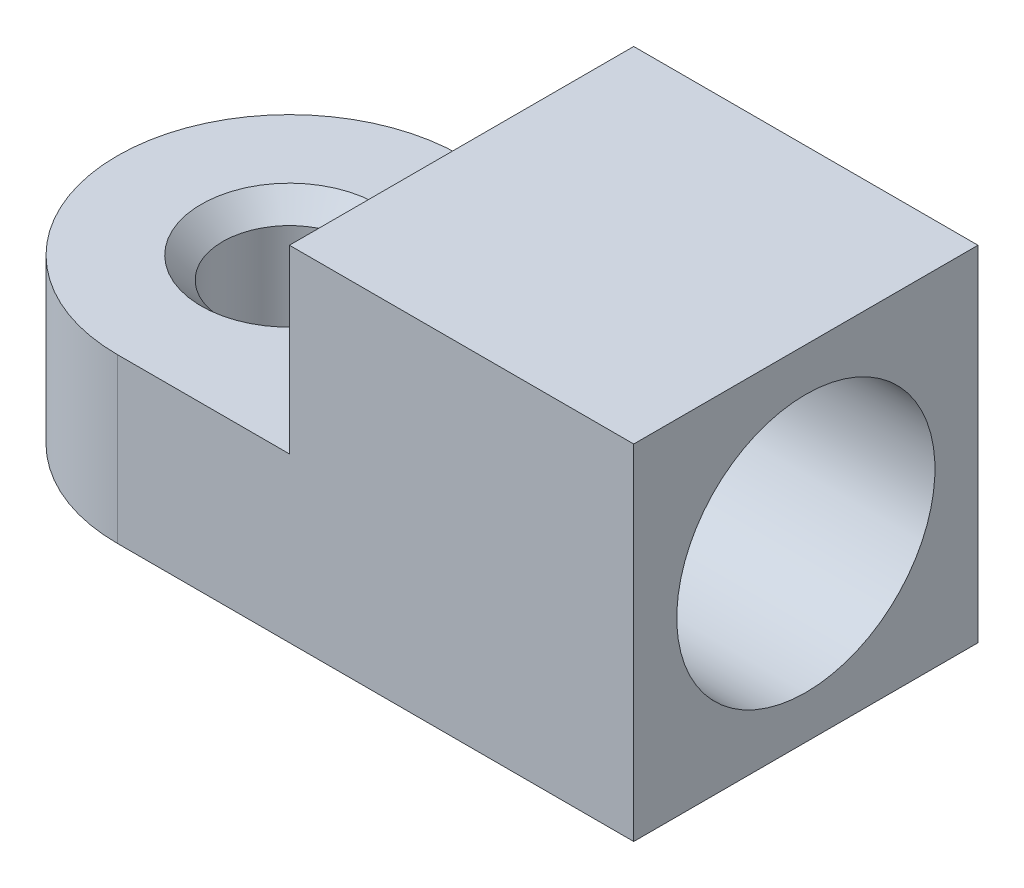
ISO-10303-21;
HEADER;
FILE_DESCRIPTION(('STEP AP214'),'2;1');
FILE_NAME('part.step','',(''),(''),'','','');
FILE_SCHEMA(('AUTOMOTIVE_DESIGN { 1 0 10303 214 1 1 1 1 }'));
ENDSEC;
DATA;
#1=APPLICATION_CONTEXT('core data for automotive mechanical design processes');
#2=APPLICATION_PROTOCOL_DEFINITION('international standard','automotive_design',2000,#1);
#3=PRODUCT_CONTEXT('',#1,'mechanical');
#4=PRODUCT('Part','Part','',(#3));
#5=PRODUCT_RELATED_PRODUCT_CATEGORY('part','',(#4));
#6=PRODUCT_DEFINITION_FORMATION('','',#4);
#7=PRODUCT_DEFINITION_CONTEXT('part definition',#1,'design');
#8=PRODUCT_DEFINITION('design','',#6,#7);
#9=PRODUCT_DEFINITION_SHAPE('','',#8);
#10=(LENGTH_UNIT() NAMED_UNIT(*) SI_UNIT(.MILLI.,.METRE.));
#11=(NAMED_UNIT(*) PLANE_ANGLE_UNIT() SI_UNIT($,.RADIAN.));
#12=(NAMED_UNIT(*) SI_UNIT($,.STERADIAN.) SOLID_ANGLE_UNIT());
#13=UNCERTAINTY_MEASURE_WITH_UNIT(LENGTH_MEASURE(1.E-05),#10,'distance_accuracy_value','');
#14=(GEOMETRIC_REPRESENTATION_CONTEXT(3) GLOBAL_UNCERTAINTY_ASSIGNED_CONTEXT((#13)) GLOBAL_UNIT_ASSIGNED_CONTEXT((#10,
#11,#12)) REPRESENTATION_CONTEXT('',''));
#15=CARTESIAN_POINT('',(0.,0.,0.));
#16=DIRECTION('',(0.,0.,1.));
#17=DIRECTION('',(1.,0.,0.));
#18=AXIS2_PLACEMENT_3D('',#15,#16,#17);
#19=CARTESIAN_POINT('',(-8.,0.,4.));
#20=DIRECTION('',(0.,1.,0.));
#21=DIRECTION('',(0.,0.,1.));
#22=AXIS2_PLACEMENT_3D('',#19,#20,#21);
#23=PLANE('',#22);
#24=CARTESIAN_POINT('',(-4.,0.,0.));
#25=DIRECTION('',(0.,1.,0.));
#26=DIRECTION('',(-1.,0.,0.));
#27=AXIS2_PLACEMENT_3D('',#24,#25,#26);
#28=CIRCLE('',#27,1.55);
#29=CARTESIAN_POINT('',(-5.55,0.,0.));
#30=VERTEX_POINT('',#29);
#31=EDGE_CURVE('E151',#30,#30,#28,.T.);
#32=ORIENTED_EDGE('',*,*,#31,.T.);
#33=EDGE_LOOP('',(#32));
#34=FACE_BOUND('',#33,.T.);
#35=CARTESIAN_POINT('',(-4.,0.,0.));
#36=DIRECTION('',(0.,1.,0.));
#37=DIRECTION('',(0.,0.,1.));
#38=AXIS2_PLACEMENT_3D('',#35,#36,#37);
#39=CIRCLE('',#38,4.);
#40=CARTESIAN_POINT('',(-4.,0.,4.));
#41=VERTEX_POINT('',#40);
#42=CARTESIAN_POINT('',(-8.,0.,0.));
#43=VERTEX_POINT('',#42);
#44=EDGE_CURVE('E108',#41,#43,#39,.F.);
#45=ORIENTED_EDGE('',*,*,#44,.T.);
#46=CARTESIAN_POINT('',(-4.,0.,0.));
#47=DIRECTION('',(0.,1.,0.));
#48=DIRECTION('',(0.,0.,1.));
#49=AXIS2_PLACEMENT_3D('',#46,#47,#48);
#50=CIRCLE('',#49,4.);
#51=CARTESIAN_POINT('',(-4.,0.,-4.));
#52=VERTEX_POINT('',#51);
#53=EDGE_CURVE('E140',#43,#52,#50,.F.);
#54=ORIENTED_EDGE('',*,*,#53,.T.);
#55=DIRECTION('',(1.,0.,0.));
#56=VECTOR('',#55,1.);
#57=CARTESIAN_POINT('',(-8.,0.,-4.));
#58=LINE('',#57,#56);
#59=CARTESIAN_POINT('',(8.,0.,-4.));
#60=VERTEX_POINT('',#59);
#61=EDGE_CURVE('E105',#52,#60,#58,.T.);
#62=ORIENTED_EDGE('',*,*,#61,.T.);
#63=DIRECTION('',(0.,0.,-1.));
#64=VECTOR('',#63,1.);
#65=CARTESIAN_POINT('',(8.,0.,4.));
#66=LINE('',#65,#64);
#67=CARTESIAN_POINT('',(8.,0.,4.));
#68=VERTEX_POINT('',#67);
#69=EDGE_CURVE('E103',#68,#60,#66,.T.);
#70=ORIENTED_EDGE('',*,*,#69,.F.);
#71=DIRECTION('',(1.,0.,0.));
#72=VECTOR('',#71,1.);
#73=CARTESIAN_POINT('',(-8.,0.,4.));
#74=LINE('',#73,#72);
#75=EDGE_CURVE('E90',#41,#68,#74,.T.);
#76=ORIENTED_EDGE('',*,*,#75,.F.);
#77=EDGE_LOOP('',(#45,#54,#62,#70,#76));
#78=FACE_BOUND('',#77,.T.);
#79=ADVANCED_FACE('F33',(#34,#78),#23,.F.);
#80=CARTESIAN_POINT('',(8.,0.,4.));
#81=DIRECTION('',(-1.,0.,0.));
#82=DIRECTION('',(0.,-1.,0.));
#83=AXIS2_PLACEMENT_3D('',#80,#81,#82);
#84=PLANE('',#83);
#85=CARTESIAN_POINT('',(8.,4.,0.));
#86=DIRECTION('',(1.,0.,0.));
#87=DIRECTION('',(0.,1.,0.));
#88=AXIS2_PLACEMENT_3D('',#85,#86,#87);
#89=CIRCLE('',#88,3.);
#90=CARTESIAN_POINT('',(8.,7.,0.));
#91=VERTEX_POINT('',#90);
#92=EDGE_CURVE('E150',#91,#91,#89,.T.);
#93=ORIENTED_EDGE('',*,*,#92,.F.);
#94=EDGE_LOOP('',(#93));
#95=FACE_BOUND('',#94,.T.);
#96=DIRECTION('',(0.,1.,0.));
#97=VECTOR('',#96,1.);
#98=CARTESIAN_POINT('',(8.,0.,-4.));
#99=LINE('',#98,#97);
#100=CARTESIAN_POINT('',(8.,8.,-4.));
#101=VERTEX_POINT('',#100);
#102=EDGE_CURVE('E125',#60,#101,#99,.T.);
#103=ORIENTED_EDGE('',*,*,#102,.T.);
#104=DIRECTION('',(0.,0.,-1.));
#105=VECTOR('',#104,1.);
#106=CARTESIAN_POINT('',(8.,8.,4.));
#107=LINE('',#106,#105);
#108=CARTESIAN_POINT('',(8.,8.,4.));
#109=VERTEX_POINT('',#108);
#110=EDGE_CURVE('E109',#109,#101,#107,.T.);
#111=ORIENTED_EDGE('',*,*,#110,.F.);
#112=DIRECTION('',(0.,1.,0.));
#113=VECTOR('',#112,1.);
#114=CARTESIAN_POINT('',(8.,0.,4.));
#115=LINE('',#114,#113);
#116=EDGE_CURVE('E94',#68,#109,#115,.T.);
#117=ORIENTED_EDGE('',*,*,#116,.F.);
#118=ORIENTED_EDGE('',*,*,#69,.T.);
#119=EDGE_LOOP('',(#103,#111,#117,#118));
#120=FACE_BOUND('',#119,.T.);
#121=ADVANCED_FACE('F111',(#95,#120),#84,.F.);
#122=CARTESIAN_POINT('',(8.,8.,4.));
#123=DIRECTION('',(0.,-1.,0.));
#124=DIRECTION('',(0.,0.,-1.));
#125=AXIS2_PLACEMENT_3D('',#122,#123,#124);
#126=PLANE('',#125);
#127=DIRECTION('',(-1.,0.,0.));
#128=VECTOR('',#127,1.);
#129=CARTESIAN_POINT('',(8.,8.,-4.));
#130=LINE('',#129,#128);
#131=CARTESIAN_POINT('',(0.,8.,-4.));
#132=VERTEX_POINT('',#131);
#133=EDGE_CURVE('E128',#101,#132,#130,.T.);
#134=ORIENTED_EDGE('',*,*,#133,.T.);
#135=DIRECTION('',(0.,0.,-1.));
#136=VECTOR('',#135,1.);
#137=CARTESIAN_POINT('',(0.,8.,4.));
#138=LINE('',#137,#136);
#139=CARTESIAN_POINT('',(0.,8.,4.));
#140=VERTEX_POINT('',#139);
#141=EDGE_CURVE('E135',#140,#132,#138,.T.);
#142=ORIENTED_EDGE('',*,*,#141,.F.);
#143=DIRECTION('',(-1.,0.,0.));
#144=VECTOR('',#143,1.);
#145=CARTESIAN_POINT('',(8.,8.,4.));
#146=LINE('',#145,#144);
#147=EDGE_CURVE('E114',#109,#140,#146,.T.);
#148=ORIENTED_EDGE('',*,*,#147,.F.);
#149=ORIENTED_EDGE('',*,*,#110,.T.);
#150=EDGE_LOOP('',(#134,#142,#148,#149));
#151=FACE_BOUND('',#150,.T.);
#152=ADVANCED_FACE('F173',(#151),#126,.F.);
#153=CARTESIAN_POINT('',(0.,8.,4.));
#154=DIRECTION('',(1.,0.,0.));
#155=DIRECTION('',(0.,1.,0.));
#156=AXIS2_PLACEMENT_3D('',#153,#154,#155);
#157=PLANE('',#156);
#158=DIRECTION('',(0.,-1.,0.));
#159=VECTOR('',#158,1.);
#160=CARTESIAN_POINT('',(0.,8.,-4.));
#161=LINE('',#160,#159);
#162=CARTESIAN_POINT('',(0.,3.8,-4.));
#163=VERTEX_POINT('',#162);
#164=EDGE_CURVE('E130',#132,#163,#161,.T.);
#165=ORIENTED_EDGE('',*,*,#164,.T.);
#166=DIRECTION('',(0.,0.,-1.));
#167=VECTOR('',#166,1.);
#168=CARTESIAN_POINT('',(0.,3.8,4.));
#169=LINE('',#168,#167);
#170=CARTESIAN_POINT('',(0.,3.8,4.));
#171=VERTEX_POINT('',#170);
#172=EDGE_CURVE('E123',#171,#163,#169,.T.);
#173=ORIENTED_EDGE('',*,*,#172,.F.);
#174=DIRECTION('',(0.,-1.,0.));
#175=VECTOR('',#174,1.);
#176=CARTESIAN_POINT('',(0.,8.,4.));
#177=LINE('',#176,#175);
#178=EDGE_CURVE('E116',#140,#171,#177,.T.);
#179=ORIENTED_EDGE('',*,*,#178,.F.);
#180=ORIENTED_EDGE('',*,*,#141,.T.);
#181=EDGE_LOOP('',(#165,#173,#179,#180));
#182=FACE_BOUND('',#181,.T.);
#183=ADVANCED_FACE('F204',(#182),#157,.F.);
#184=CARTESIAN_POINT('',(0.,3.8,4.));
#185=DIRECTION('',(0.,-1.,0.));
#186=DIRECTION('',(1.,0.,0.));
#187=AXIS2_PLACEMENT_3D('',#184,#185,#186);
#188=PLANE('',#187);
#189=CARTESIAN_POINT('',(-4.,3.8,0.));
#190=DIRECTION('',(0.,-1.,0.));
#191=DIRECTION('',(1.,0.,0.));
#192=AXIS2_PLACEMENT_3D('',#189,#190,#191);
#193=CIRCLE('',#192,2.05000000000002);
#194=CARTESIAN_POINT('',(-1.94999999999998,3.8,0.));
#195=VERTEX_POINT('',#194);
#196=EDGE_CURVE('E11',#195,#195,#193,.T.);
#197=ORIENTED_EDGE('',*,*,#196,.T.);
#198=EDGE_LOOP('',(#197));
#199=FACE_BOUND('',#198,.T.);
#200=DIRECTION('',(-1.,0.,0.));
#201=VECTOR('',#200,1.);
#202=CARTESIAN_POINT('',(0.,3.8,-4.));
#203=LINE('',#202,#201);
#204=CARTESIAN_POINT('',(-4.,3.8,-4.));
#205=VERTEX_POINT('',#204);
#206=EDGE_CURVE('E100',#163,#205,#203,.T.);
#207=ORIENTED_EDGE('',*,*,#206,.T.);
#208=CARTESIAN_POINT('',(-4.,3.8,0.));
#209=DIRECTION('',(0.,-1.,0.));
#210=DIRECTION('',(1.,0.,0.));
#211=AXIS2_PLACEMENT_3D('',#208,#209,#210);
#212=CIRCLE('',#211,4.);
#213=CARTESIAN_POINT('',(-8.,3.8,0.));
#214=VERTEX_POINT('',#213);
#215=EDGE_CURVE('E53',#205,#214,#212,.F.);
#216=ORIENTED_EDGE('',*,*,#215,.T.);
#217=CARTESIAN_POINT('',(-4.,3.8,0.));
#218=DIRECTION('',(0.,-1.,0.));
#219=DIRECTION('',(1.,0.,0.));
#220=AXIS2_PLACEMENT_3D('',#217,#218,#219);
#221=CIRCLE('',#220,4.);
#222=CARTESIAN_POINT('',(-4.,3.8,4.));
#223=VERTEX_POINT('',#222);
#224=EDGE_CURVE('E48',#214,#223,#221,.F.);
#225=ORIENTED_EDGE('',*,*,#224,.T.);
#226=DIRECTION('',(-1.,0.,0.));
#227=VECTOR('',#226,1.);
#228=CARTESIAN_POINT('',(0.,3.8,4.));
#229=LINE('',#228,#227);
#230=EDGE_CURVE('E121',#171,#223,#229,.T.);
#231=ORIENTED_EDGE('',*,*,#230,.F.);
#232=ORIENTED_EDGE('',*,*,#172,.T.);
#233=EDGE_LOOP('',(#207,#216,#225,#231,#232));
#234=FACE_BOUND('',#233,.T.);
#235=ADVANCED_FACE('F205',(#199,#234),#188,.F.);
#236=CARTESIAN_POINT('',(0.,0.,4.));
#237=DIRECTION('',(0.,0.,1.));
#238=DIRECTION('',(1.,0.,0.));
#239=AXIS2_PLACEMENT_3D('',#236,#237,#238);
#240=PLANE('',#239);
#241=ORIENTED_EDGE('',*,*,#230,.T.);
#242=DIRECTION('',(0.,-1.,0.));
#243=VECTOR('',#242,1.);
#244=CARTESIAN_POINT('',(-4.,0.,4.));
#245=LINE('',#244,#243);
#246=EDGE_CURVE('E97',#223,#41,#245,.T.);
#247=ORIENTED_EDGE('',*,*,#246,.T.);
#248=ORIENTED_EDGE('',*,*,#75,.T.);
#249=ORIENTED_EDGE('',*,*,#116,.T.);
#250=ORIENTED_EDGE('',*,*,#147,.T.);
#251=ORIENTED_EDGE('',*,*,#178,.T.);
#252=EDGE_LOOP('',(#241,#247,#248,#249,#250,#251));
#253=FACE_BOUND('',#252,.T.);
#254=ADVANCED_FACE('F92',(#253),#240,.T.);
#255=CARTESIAN_POINT('',(0.,0.,-4.));
#256=DIRECTION('',(0.,0.,1.));
#257=DIRECTION('',(1.,0.,0.));
#258=AXIS2_PLACEMENT_3D('',#255,#256,#257);
#259=PLANE('',#258);
#260=ORIENTED_EDGE('',*,*,#61,.F.);
#261=DIRECTION('',(0.,-1.,0.));
#262=VECTOR('',#261,1.);
#263=CARTESIAN_POINT('',(-4.,0.,-4.));
#264=LINE('',#263,#262);
#265=EDGE_CURVE('E142',#52,#205,#264,.F.);
#266=ORIENTED_EDGE('',*,*,#265,.T.);
#267=ORIENTED_EDGE('',*,*,#206,.F.);
#268=ORIENTED_EDGE('',*,*,#164,.F.);
#269=ORIENTED_EDGE('',*,*,#133,.F.);
#270=ORIENTED_EDGE('',*,*,#102,.F.);
#271=EDGE_LOOP('',(#260,#266,#267,#268,#269,#270));
#272=FACE_BOUND('',#271,.T.);
#273=ADVANCED_FACE('F195',(#272),#259,.F.);
#274=CARTESIAN_POINT('',(1.,4.,0.));
#275=DIRECTION('',(1.,0.,0.));
#276=DIRECTION('',(0.,1.,0.));
#277=AXIS2_PLACEMENT_3D('',#274,#275,#276);
#278=CYLINDRICAL_SURFACE('',#277,3.);
#279=CARTESIAN_POINT('',(1.,4.,0.));
#280=DIRECTION('',(1.,0.,0.));
#281=DIRECTION('',(0.,1.,0.));
#282=AXIS2_PLACEMENT_3D('',#279,#280,#281);
#283=CIRCLE('',#282,3.);
#284=CARTESIAN_POINT('',(0.999999999999999,7.,0.));
#285=VERTEX_POINT('',#284);
#286=EDGE_CURVE('E126',#285,#285,#283,.T.);
#287=ORIENTED_EDGE('',*,*,#286,.F.);
#288=EDGE_LOOP('',(#287));
#289=FACE_BOUND('',#288,.T.);
#290=ORIENTED_EDGE('',*,*,#92,.T.);
#291=EDGE_LOOP('',(#290));
#292=FACE_BOUND('',#291,.T.);
#293=ADVANCED_FACE('F188',(#289,#292),#278,.F.);
#294=CARTESIAN_POINT('',(1.,4.,0.));
#295=DIRECTION('',(1.,0.,0.));
#296=DIRECTION('',(0.,1.,0.));
#297=AXIS2_PLACEMENT_3D('',#294,#295,#296);
#298=PLANE('',#297);
#299=ORIENTED_EDGE('',*,*,#286,.T.);
#300=EDGE_LOOP('',(#299));
#301=FACE_BOUND('',#300,.T.);
#302=ADVANCED_FACE('F183',(#301),#298,.T.);
#303=CARTESIAN_POINT('',(-4.,0.,0.));
#304=DIRECTION('',(0.,1.,0.));
#305=DIRECTION('',(-1.,0.,0.));
#306=AXIS2_PLACEMENT_3D('',#303,#304,#305);
#307=CYLINDRICAL_SURFACE('',#306,4.);
#308=ORIENTED_EDGE('',*,*,#246,.F.);
#309=ORIENTED_EDGE('',*,*,#224,.F.);
#310=DIRECTION('',(0.,-1.,0.));
#311=VECTOR('',#310,1.);
#312=CARTESIAN_POINT('',(-8.,3.8,0.));
#313=LINE('',#312,#311);
#314=EDGE_CURVE('E148',#43,#214,#313,.F.);
#315=ORIENTED_EDGE('',*,*,#314,.F.);
#316=ORIENTED_EDGE('',*,*,#44,.F.);
#317=EDGE_LOOP('',(#308,#309,#315,#316));
#318=FACE_BOUND('',#317,.T.);
#319=ADVANCED_FACE('F180',(#318),#307,.T.);
#320=CARTESIAN_POINT('',(-4.,3.8,0.));
#321=DIRECTION('',(0.,-1.,0.));
#322=DIRECTION('',(1.,0.,0.));
#323=AXIS2_PLACEMENT_3D('',#320,#321,#322);
#324=CYLINDRICAL_SURFACE('',#323,4.);
#325=ORIENTED_EDGE('',*,*,#215,.F.);
#326=ORIENTED_EDGE('',*,*,#265,.F.);
#327=ORIENTED_EDGE('',*,*,#53,.F.);
#328=ORIENTED_EDGE('',*,*,#314,.T.);
#329=EDGE_LOOP('',(#325,#326,#327,#328));
#330=FACE_BOUND('',#329,.T.);
#331=ADVANCED_FACE('F164',(#330),#324,.T.);
#332=CARTESIAN_POINT('',(-4.,0.,0.));
#333=DIRECTION('',(0.,1.,0.));
#334=DIRECTION('',(-1.,0.,0.));
#335=AXIS2_PLACEMENT_3D('',#332,#333,#334);
#336=CYLINDRICAL_SURFACE('',#335,1.55);
#337=CARTESIAN_POINT('',(-4.,3.29999999999999,0.));
#338=DIRECTION('',(0.,-1.,0.));
#339=DIRECTION('',(0.,0.,-1.));
#340=AXIS2_PLACEMENT_3D('',#337,#338,#339);
#341=CIRCLE('',#340,1.55);
#342=CARTESIAN_POINT('',(-5.55,3.29999999999999,0.));
#343=VERTEX_POINT('',#342);
#344=EDGE_CURVE('E41',#343,#343,#341,.F.);
#345=CARTESIAN_POINT('',(-5.55,3.29999999999999,0.));
#346=CARTESIAN_POINT('',(-5.55,3.26562499999999,0.));
#347=CARTESIAN_POINT('',(-5.55,3.23124999999999,0.));
#348=CARTESIAN_POINT('',(-5.55,3.16249999999999,0.));
#349=CARTESIAN_POINT('',(-5.55,3.12812499999999,0.));
#350=CARTESIAN_POINT('',(-5.55,3.05937499999999,0.));
#351=CARTESIAN_POINT('',(-5.55,3.02499999999999,0.));
#352=CARTESIAN_POINT('',(-5.55,2.95624999999999,0.));
#353=CARTESIAN_POINT('',(-5.55,2.92187499999999,0.));
#354=CARTESIAN_POINT('',(-5.55,2.85312499999999,0.));
#355=CARTESIAN_POINT('',(-5.55,2.81874999999999,0.));
#356=CARTESIAN_POINT('',(-5.55,2.74999999999999,0.));
#357=CARTESIAN_POINT('',(-5.55,2.71562499999999,0.));
#358=CARTESIAN_POINT('',(-5.55,2.64687499999999,0.));
#359=CARTESIAN_POINT('',(-5.55,2.61249999999999,0.));
#360=CARTESIAN_POINT('',(-5.55,2.54374999999999,0.));
#361=CARTESIAN_POINT('',(-5.55,2.50937499999999,0.));
#362=CARTESIAN_POINT('',(-5.55,2.44062499999999,0.));
#363=CARTESIAN_POINT('',(-5.55,2.40624999999999,0.));
#364=CARTESIAN_POINT('',(-5.55,2.33749999999999,0.));
#365=CARTESIAN_POINT('',(-5.55,2.30312499999999,0.));
#366=CARTESIAN_POINT('',(-5.55,2.23437499999999,0.));
#367=CARTESIAN_POINT('',(-5.55,2.19999999999999,0.));
#368=CARTESIAN_POINT('',(-5.55,2.13124999999999,0.));
#369=CARTESIAN_POINT('',(-5.55,2.09687499999999,0.));
#370=CARTESIAN_POINT('',(-5.55,2.02812499999999,0.));
#371=CARTESIAN_POINT('',(-5.55,1.99374999999999,0.));
#372=CARTESIAN_POINT('',(-5.55,1.92499999999999,0.));
#373=CARTESIAN_POINT('',(-5.55,1.89062499999999,0.));
#374=CARTESIAN_POINT('',(-5.55,1.82187499999999,0.));
#375=CARTESIAN_POINT('',(-5.55,1.78749999999999,0.));
#376=CARTESIAN_POINT('',(-5.55,1.71874999999999,0.));
#377=CARTESIAN_POINT('',(-5.55,1.68437499999999,0.));
#378=CARTESIAN_POINT('',(-5.55,1.61562499999999,0.));
#379=CARTESIAN_POINT('',(-5.55,1.58124999999999,0.));
#380=CARTESIAN_POINT('',(-5.55,1.51249999999999,0.));
#381=CARTESIAN_POINT('',(-5.55,1.47812499999999,0.));
#382=CARTESIAN_POINT('',(-5.55,1.40937499999999,0.));
#383=CARTESIAN_POINT('',(-5.55,1.37499999999999,0.));
#384=CARTESIAN_POINT('',(-5.55,1.30624999999999,0.));
#385=CARTESIAN_POINT('',(-5.55,1.27187499999999,0.));
#386=CARTESIAN_POINT('',(-5.55,1.20312499999999,0.));
#387=CARTESIAN_POINT('',(-5.55,1.16874999999999,0.));
#388=CARTESIAN_POINT('',(-5.55,1.09999999999999,0.));
#389=CARTESIAN_POINT('',(-5.55,1.06562499999999,0.));
#390=CARTESIAN_POINT('',(-5.55,0.996874999999994,0.));
#391=CARTESIAN_POINT('',(-5.55,0.962499999999994,0.));
#392=CARTESIAN_POINT('',(-5.55,0.893749999999995,0.));
#393=CARTESIAN_POINT('',(-5.55,0.859374999999995,0.));
#394=CARTESIAN_POINT('',(-5.55,0.790624999999995,0.));
#395=CARTESIAN_POINT('',(-5.55,0.756249999999995,0.));
#396=CARTESIAN_POINT('',(-5.55,0.687499999999996,0.));
#397=CARTESIAN_POINT('',(-5.55,0.653124999999996,0.));
#398=CARTESIAN_POINT('',(-5.55,0.584374999999996,0.));
#399=CARTESIAN_POINT('',(-5.55,0.549999999999996,0.));
#400=CARTESIAN_POINT('',(-5.55,0.481249999999996,0.));
#401=CARTESIAN_POINT('',(-5.55,0.446874999999997,0.));
#402=CARTESIAN_POINT('',(-5.55,0.378124999999997,0.));
#403=CARTESIAN_POINT('',(-5.55,0.343749999999997,0.));
#404=CARTESIAN_POINT('',(-5.55,0.274999999999997,0.));
#405=CARTESIAN_POINT('',(-5.55,0.240624999999997,0.));
#406=CARTESIAN_POINT('',(-5.55,0.171874999999998,0.));
#407=CARTESIAN_POINT('',(-5.55,0.137499999999998,0.));
#408=CARTESIAN_POINT('',(-5.55,0.0687499999999982,0.));
#409=CARTESIAN_POINT('',(-5.55,0.0343749999999984,0.));
#410=CARTESIAN_POINT('',(-5.55,0.,0.));
#411=B_SPLINE_CURVE_WITH_KNOTS('',3,(#345,#346,#347,#348,#349,#350,#351,#352,#353,#354,#355,
#356,#357,#358,#359,#360,#361,#362,#363,#364,#365,#366,#367,#368,#369,#370,#371,#372,#373,#374,
#375,#376,#377,#378,#379,#380,#381,#382,#383,#384,#385,#386,#387,#388,#389,#390,#391,#392,#393,
#394,#395,#396,#397,#398,#399,#400,#401,#402,#403,#404,#405,#406,#407,#408,#409,#410),
.UNSPECIFIED.,.F.,.F.,(4,2,2,2,2,2,2,2,2,2,2,2,2,2,2,2,2,2,2,2,2,2,2,2,2,2,2,2,2,2,2,2,4),(0.,
0.103124999999999,0.206249999999999,0.309374999999999,0.412499999999998,0.515624999999998,
0.618749999999998,0.721874999999997,0.824999999999997,0.928124999999996,1.03125,1.134375,1.2375,
1.34062499999999,1.44374999999999,1.54687499999999,1.64999999999999,1.75312499999999,
1.85624999999999,1.95937499999999,2.06249999999999,2.16562499999999,2.26874999999999,
2.37187499999999,2.47499999999999,2.57812499999999,2.68124999999999,2.78437499999999,
2.88749999999999,2.99062499999999,3.09374999999999,3.19687499999999,3.29999999999999),.UNSPECIFIED.);
#412=EDGE_CURVE('BSEAM155',#343,#30,#411,.T.);
#413=ORIENTED_EDGE('',*,*,#344,.T.);
#414=ORIENTED_EDGE('',*,*,#31,.F.);
#415=ORIENTED_EDGE('',*,*,#412,.T.);
#416=ORIENTED_EDGE('',*,*,#412,.F.);
#417=EDGE_LOOP('',(#413,#415,#414,#416));
#418=FACE_BOUND('',#417,.T.);
#419=ADVANCED_FACE('F155',(#418),#336,.F.);
#420=CARTESIAN_POINT('',(-4.,3.29999999999998,0.));
#421=DIRECTION('',(0.,1.,0.));
#422=DIRECTION('',(0.,0.,1.));
#423=AXIS2_PLACEMENT_3D('',#420,#421,#422);
#424=CONICAL_SURFACE('',#423,1.55,0.785398163397451);
#425=ORIENTED_EDGE('',*,*,#196,.F.);
#426=EDGE_LOOP('',(#425));
#427=FACE_BOUND('',#426,.T.);
#428=ORIENTED_EDGE('',*,*,#344,.F.);
#429=EDGE_LOOP('',(#428));
#430=FACE_BOUND('',#429,.T.);
#431=ADVANCED_FACE('F35',(#427,#430),#424,.F.);
#432=CLOSED_SHELL('',(#79,#121,#152,#183,#235,#254,#273,#293,#302,#319,#331,#419,#431));
#433=MANIFOLD_SOLID_BREP('B2',#432);
#434=ADVANCED_BREP_SHAPE_REPRESENTATION('',(#18,#433),#14);
#435=SHAPE_DEFINITION_REPRESENTATION(#9,#434);
ENDSEC;
END-ISO-10303-21;
